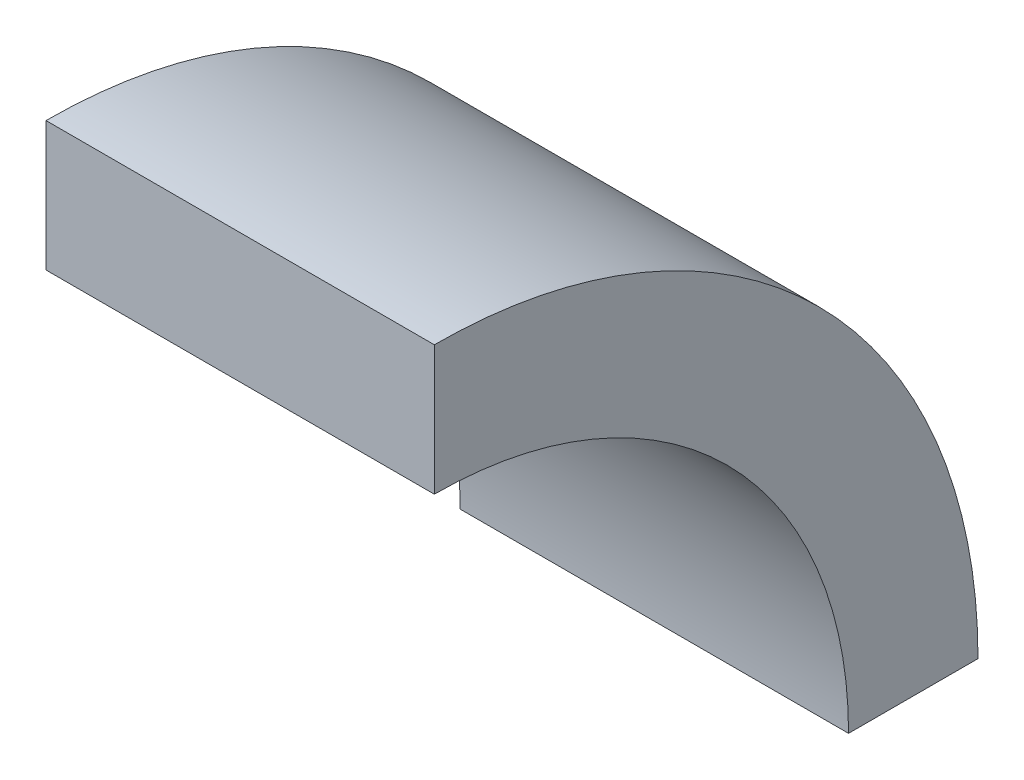
ISO-10303-21;
HEADER;
FILE_DESCRIPTION(('STEP AP214'),'2;1');
FILE_NAME('part.step','',(''),(''),'','','');
FILE_SCHEMA(('AUTOMOTIVE_DESIGN { 1 0 10303 214 1 1 1 1 }'));
ENDSEC;
DATA;
#1=APPLICATION_CONTEXT('core data for automotive mechanical design processes');
#2=APPLICATION_PROTOCOL_DEFINITION('international standard','automotive_design',2000,#1);
#3=PRODUCT_CONTEXT('',#1,'mechanical');
#4=PRODUCT('Part','Part','',(#3));
#5=PRODUCT_RELATED_PRODUCT_CATEGORY('part','',(#4));
#6=PRODUCT_DEFINITION_FORMATION('','',#4);
#7=PRODUCT_DEFINITION_CONTEXT('part definition',#1,'design');
#8=PRODUCT_DEFINITION('design','',#6,#7);
#9=PRODUCT_DEFINITION_SHAPE('','',#8);
#10=(LENGTH_UNIT() NAMED_UNIT(*) SI_UNIT(.MILLI.,.METRE.));
#11=(NAMED_UNIT(*) PLANE_ANGLE_UNIT() SI_UNIT($,.RADIAN.));
#12=(NAMED_UNIT(*) SI_UNIT($,.STERADIAN.) SOLID_ANGLE_UNIT());
#13=UNCERTAINTY_MEASURE_WITH_UNIT(LENGTH_MEASURE(1.E-05),#10,'distance_accuracy_value','');
#14=(GEOMETRIC_REPRESENTATION_CONTEXT(3) GLOBAL_UNCERTAINTY_ASSIGNED_CONTEXT((#13)) GLOBAL_UNIT_ASSIGNED_CONTEXT((#10,
#11,#12)) REPRESENTATION_CONTEXT('',''));
#15=CARTESIAN_POINT('',(0.,0.,0.));
#16=DIRECTION('',(0.,0.,1.));
#17=DIRECTION('',(1.,0.,0.));
#18=AXIS2_PLACEMENT_3D('',#15,#16,#17);
#19=CARTESIAN_POINT('',(15.,42.,37.0000000000002));
#20=DIRECTION('',(-1.,0.,0.));
#21=DIRECTION('',(0.,0.,1.));
#22=AXIS2_PLACEMENT_3D('',#19,#20,#21);
#23=PLANE('',#22);
#24=CARTESIAN_POINT('',(15.,0.,37.));
#25=DIRECTION('',(-1.,0.,0.));
#26=DIRECTION('',(0.,0.,1.));
#27=AXIS2_PLACEMENT_3D('',#24,#25,#26);
#28=CIRCLE('',#27,42.);
#29=CARTESIAN_POINT('',(15.,42.,37.0000000000002));
#30=VERTEX_POINT('',#29);
#31=CARTESIAN_POINT('',(15.,0.,-5.));
#32=VERTEX_POINT('',#31);
#33=EDGE_CURVE('E11',#30,#32,#28,.T.);
#34=ORIENTED_EDGE('',*,*,#33,.F.);
#35=DIRECTION('',(0.,1.,0.));
#36=VECTOR('',#35,1.);
#37=CARTESIAN_POINT('',(15.,42.,37.0000000000002));
#38=LINE('',#37,#36);
#39=CARTESIAN_POINT('',(15.,32.,37.0000000000001));
#40=VERTEX_POINT('',#39);
#41=EDGE_CURVE('E95',#40,#30,#38,.T.);
#42=ORIENTED_EDGE('',*,*,#41,.F.);
#43=CARTESIAN_POINT('',(15.,0.,37.));
#44=DIRECTION('',(-1.,0.,0.));
#45=DIRECTION('',(0.,0.,1.));
#46=AXIS2_PLACEMENT_3D('',#43,#44,#45);
#47=CIRCLE('',#46,32.);
#48=CARTESIAN_POINT('',(15.,0.,5.));
#49=VERTEX_POINT('',#48);
#50=EDGE_CURVE('E48',#40,#49,#47,.T.);
#51=ORIENTED_EDGE('',*,*,#50,.T.);
#52=DIRECTION('',(0.,0.,-1.));
#53=VECTOR('',#52,1.);
#54=CARTESIAN_POINT('',(15.,0.,-5.));
#55=LINE('',#54,#53);
#56=EDGE_CURVE('E84',#49,#32,#55,.T.);
#57=ORIENTED_EDGE('',*,*,#56,.T.);
#58=EDGE_LOOP('',(#34,#42,#51,#57));
#59=FACE_BOUND('',#58,.T.);
#60=ADVANCED_FACE('F33',(#59),#23,.F.);
#61=CARTESIAN_POINT('',(-19.9890259365994,0.,37.));
#62=DIRECTION('',(-1.,0.,0.));
#63=DIRECTION('',(0.,0.,1.));
#64=AXIS2_PLACEMENT_3D('',#61,#62,#63);
#65=CYLINDRICAL_SURFACE('',#64,42.);
#66=CARTESIAN_POINT('',(-15.,0.,37.));
#67=DIRECTION('',(-1.,0.,0.));
#68=DIRECTION('',(0.,0.,1.));
#69=AXIS2_PLACEMENT_3D('',#66,#67,#68);
#70=CIRCLE('',#69,42.);
#71=CARTESIAN_POINT('',(-15.,42.,37.0000000000002));
#72=VERTEX_POINT('',#71);
#73=CARTESIAN_POINT('',(-15.,0.,-5.));
#74=VERTEX_POINT('',#73);
#75=EDGE_CURVE('E41',#72,#74,#70,.T.);
#76=ORIENTED_EDGE('',*,*,#75,.F.);
#77=DIRECTION('',(-1.,0.,0.));
#78=VECTOR('',#77,1.);
#79=CARTESIAN_POINT('',(-15.,42.,37.0000000000002));
#80=LINE('',#79,#78);
#81=EDGE_CURVE('E80',#30,#72,#80,.T.);
#82=ORIENTED_EDGE('',*,*,#81,.F.);
#83=ORIENTED_EDGE('',*,*,#33,.T.);
#84=DIRECTION('',(-1.,0.,0.));
#85=VECTOR('',#84,1.);
#86=CARTESIAN_POINT('',(-15.,0.,-5.));
#87=LINE('',#86,#85);
#88=EDGE_CURVE('E77',#32,#74,#87,.T.);
#89=ORIENTED_EDGE('',*,*,#88,.T.);
#90=EDGE_LOOP('',(#76,#82,#83,#89));
#91=FACE_BOUND('',#90,.T.);
#92=ADVANCED_FACE('F35',(#91),#65,.T.);
#93=CARTESIAN_POINT('',(-15.,42.,37.0000000000002));
#94=DIRECTION('',(1.,0.,0.));
#95=DIRECTION('',(0.,0.,-1.));
#96=AXIS2_PLACEMENT_3D('',#93,#94,#95);
#97=PLANE('',#96);
#98=CARTESIAN_POINT('',(-15.,0.,37.));
#99=DIRECTION('',(-1.,0.,0.));
#100=DIRECTION('',(0.,0.,1.));
#101=AXIS2_PLACEMENT_3D('',#98,#99,#100);
#102=CIRCLE('',#101,32.);
#103=CARTESIAN_POINT('',(-15.,32.,37.0000000000001));
#104=VERTEX_POINT('',#103);
#105=CARTESIAN_POINT('',(-15.,0.,5.));
#106=VERTEX_POINT('',#105);
#107=EDGE_CURVE('E56',#104,#106,#102,.T.);
#108=ORIENTED_EDGE('',*,*,#107,.F.);
#109=DIRECTION('',(0.,-1.,0.));
#110=VECTOR('',#109,1.);
#111=CARTESIAN_POINT('',(-15.,42.,37.0000000000002));
#112=LINE('',#111,#110);
#113=EDGE_CURVE('E98',#72,#104,#112,.T.);
#114=ORIENTED_EDGE('',*,*,#113,.F.);
#115=ORIENTED_EDGE('',*,*,#75,.T.);
#116=DIRECTION('',(0.,0.,1.));
#117=VECTOR('',#116,1.);
#118=CARTESIAN_POINT('',(-15.,0.,-5.));
#119=LINE('',#118,#117);
#120=EDGE_CURVE('E89',#74,#106,#119,.T.);
#121=ORIENTED_EDGE('',*,*,#120,.T.);
#122=EDGE_LOOP('',(#108,#114,#115,#121));
#123=FACE_BOUND('',#122,.T.);
#124=ADVANCED_FACE('F104',(#123),#97,.F.);
#125=CARTESIAN_POINT('',(-19.9890259365994,0.,37.));
#126=DIRECTION('',(-1.,0.,0.));
#127=DIRECTION('',(0.,0.,1.));
#128=AXIS2_PLACEMENT_3D('',#125,#126,#127);
#129=CYLINDRICAL_SURFACE('',#128,32.);
#130=DIRECTION('',(1.,0.,0.));
#131=VECTOR('',#130,1.);
#132=CARTESIAN_POINT('',(-15.,32.,37.0000000000001));
#133=LINE('',#132,#131);
#134=EDGE_CURVE('E100',#104,#40,#133,.T.);
#135=ORIENTED_EDGE('',*,*,#134,.F.);
#136=ORIENTED_EDGE('',*,*,#107,.T.);
#137=DIRECTION('',(1.,0.,0.));
#138=VECTOR('',#137,1.);
#139=CARTESIAN_POINT('',(-15.,0.,5.));
#140=LINE('',#139,#138);
#141=EDGE_CURVE('E91',#106,#49,#140,.T.);
#142=ORIENTED_EDGE('',*,*,#141,.T.);
#143=ORIENTED_EDGE('',*,*,#50,.F.);
#144=EDGE_LOOP('',(#135,#136,#142,#143));
#145=FACE_BOUND('',#144,.T.);
#146=ADVANCED_FACE('F107',(#145),#129,.F.);
#147=CARTESIAN_POINT('',(0.,37.,37.0000000000001));
#148=DIRECTION('',(0.,0.,1.));
#149=DIRECTION('',(0.,-1.,0.));
#150=AXIS2_PLACEMENT_3D('',#147,#148,#149);
#151=PLANE('',#150);
#152=ORIENTED_EDGE('',*,*,#41,.T.);
#153=ORIENTED_EDGE('',*,*,#81,.T.);
#154=ORIENTED_EDGE('',*,*,#113,.T.);
#155=ORIENTED_EDGE('',*,*,#134,.T.);
#156=EDGE_LOOP('',(#152,#153,#154,#155));
#157=FACE_BOUND('',#156,.T.);
#158=ADVANCED_FACE('F106',(#157),#151,.T.);
#159=CARTESIAN_POINT('',(0.,0.,0.));
#160=DIRECTION('',(0.,1.,0.));
#161=DIRECTION('',(0.,0.,1.));
#162=AXIS2_PLACEMENT_3D('',#159,#160,#161);
#163=PLANE('',#162);
#164=ORIENTED_EDGE('',*,*,#56,.F.);
#165=ORIENTED_EDGE('',*,*,#141,.F.);
#166=ORIENTED_EDGE('',*,*,#120,.F.);
#167=ORIENTED_EDGE('',*,*,#88,.F.);
#168=EDGE_LOOP('',(#164,#165,#166,#167));
#169=FACE_BOUND('',#168,.T.);
#170=ADVANCED_FACE('F88',(#169),#163,.F.);
#171=CLOSED_SHELL('',(#60,#92,#124,#146,#158,#170));
#172=MANIFOLD_SOLID_BREP('B2',#171);
#173=ADVANCED_BREP_SHAPE_REPRESENTATION('',(#18,#172),#14);
#174=SHAPE_DEFINITION_REPRESENTATION(#9,#173);
ENDSEC;
END-ISO-10303-21;
